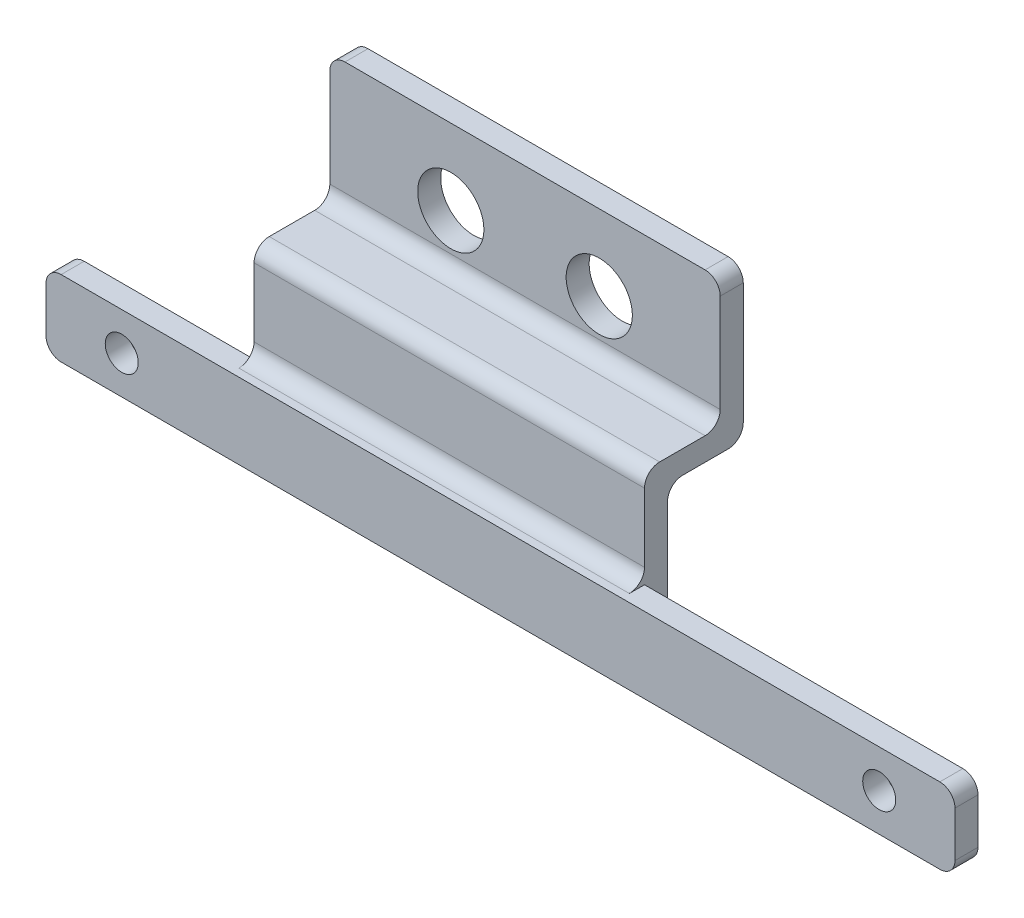
ISO-10303-21;
HEADER;
FILE_DESCRIPTION(('STEP AP214'),'2;1');
FILE_NAME('part.step','',(''),(''),'','','');
FILE_SCHEMA(('AUTOMOTIVE_DESIGN { 1 0 10303 214 1 1 1 1 }'));
ENDSEC;
DATA;
#1=APPLICATION_CONTEXT('core data for automotive mechanical design processes');
#2=APPLICATION_PROTOCOL_DEFINITION('international standard','automotive_design',2000,#1);
#3=PRODUCT_CONTEXT('',#1,'mechanical');
#4=PRODUCT('Part','Part','',(#3));
#5=PRODUCT_RELATED_PRODUCT_CATEGORY('part','',(#4));
#6=PRODUCT_DEFINITION_FORMATION('','',#4);
#7=PRODUCT_DEFINITION_CONTEXT('part definition',#1,'design');
#8=PRODUCT_DEFINITION('design','',#6,#7);
#9=PRODUCT_DEFINITION_SHAPE('','',#8);
#10=(LENGTH_UNIT() NAMED_UNIT(*) SI_UNIT(.MILLI.,.METRE.));
#11=(NAMED_UNIT(*) PLANE_ANGLE_UNIT() SI_UNIT($,.RADIAN.));
#12=(NAMED_UNIT(*) SI_UNIT($,.STERADIAN.) SOLID_ANGLE_UNIT());
#13=UNCERTAINTY_MEASURE_WITH_UNIT(LENGTH_MEASURE(1.E-05),#10,'distance_accuracy_value','');
#14=(GEOMETRIC_REPRESENTATION_CONTEXT(3) GLOBAL_UNCERTAINTY_ASSIGNED_CONTEXT((#13)) GLOBAL_UNIT_ASSIGNED_CONTEXT((#10,
#11,#12)) REPRESENTATION_CONTEXT('',''));
#15=CARTESIAN_POINT('',(0.,0.,0.));
#16=DIRECTION('',(0.,0.,1.));
#17=DIRECTION('',(1.,0.,0.));
#18=AXIS2_PLACEMENT_3D('',#15,#16,#17);
#19=CARTESIAN_POINT('',(0.,0.,6.52));
#20=DIRECTION('',(0.,0.,-1.));
#21=DIRECTION('',(-1.,0.,0.));
#22=AXIS2_PLACEMENT_3D('',#19,#20,#21);
#23=PLANE('',#22);
#24=DIRECTION('',(0.,-1.,0.));
#25=VECTOR('',#24,1.);
#26=CARTESIAN_POINT('',(-12.885,-5.,6.52));
#27=LINE('',#26,#25);
#28=CARTESIAN_POINT('',(-12.885,-4.48,6.52));
#29=VERTEX_POINT('',#28);
#30=CARTESIAN_POINT('',(-12.885,-9.,6.52));
#31=VERTEX_POINT('',#30);
#32=EDGE_CURVE('E229',#29,#31,#27,.T.);
#33=ORIENTED_EDGE('',*,*,#32,.T.);
#34=DIRECTION('',(-1.,0.,0.));
#35=VECTOR('',#34,1.);
#36=CARTESIAN_POINT('',(12.885,-9.,6.52));
#37=LINE('',#36,#35);
#38=CARTESIAN_POINT('',(12.885,-9.,6.52));
#39=VERTEX_POINT('',#38);
#40=EDGE_CURVE('E381',#31,#39,#37,.F.);
#41=ORIENTED_EDGE('',*,*,#40,.T.);
#42=DIRECTION('',(0.,1.,0.));
#43=VECTOR('',#42,1.);
#44=CARTESIAN_POINT('',(12.885,-3.48,6.52));
#45=LINE('',#44,#43);
#46=CARTESIAN_POINT('',(12.885,-4.48,6.52));
#47=VERTEX_POINT('',#46);
#48=EDGE_CURVE('E315',#39,#47,#45,.T.);
#49=ORIENTED_EDGE('',*,*,#48,.T.);
#50=DIRECTION('',(-1.,0.,0.));
#51=VECTOR('',#50,1.);
#52=CARTESIAN_POINT('',(0.,-4.48,6.52));
#53=LINE('',#52,#51);
#54=EDGE_CURVE('E377',#47,#29,#53,.T.);
#55=ORIENTED_EDGE('',*,*,#54,.T.);
#56=EDGE_LOOP('',(#33,#41,#49,#55));
#57=FACE_BOUND('',#56,.T.);
#58=ADVANCED_FACE('F33',(#57),#23,.F.);
#59=CARTESIAN_POINT('',(-12.885,-5.,1.52));
#60=DIRECTION('',(0.,1.,0.));
#61=DIRECTION('',(0.,0.,1.));
#62=AXIS2_PLACEMENT_3D('',#59,#60,#61);
#63=PLANE('',#62);
#64=DIRECTION('',(0.,0.,-1.));
#65=VECTOR('',#64,1.);
#66=CARTESIAN_POINT('',(-12.885,-5.,1.52));
#67=LINE('',#66,#65);
#68=CARTESIAN_POINT('',(-12.885,-5.,4.));
#69=VERTEX_POINT('',#68);
#70=CARTESIAN_POINT('',(-12.885,-5.,1.));
#71=VERTEX_POINT('',#70);
#72=EDGE_CURVE('E262',#69,#71,#67,.T.);
#73=ORIENTED_EDGE('',*,*,#72,.T.);
#74=DIRECTION('',(1.,0.,0.));
#75=VECTOR('',#74,1.);
#76=CARTESIAN_POINT('',(-12.885,-5.,1.));
#77=LINE('',#76,#75);
#78=CARTESIAN_POINT('',(12.885,-5.,1.));
#79=VERTEX_POINT('',#78);
#80=EDGE_CURVE('E451',#71,#79,#77,.T.);
#81=ORIENTED_EDGE('',*,*,#80,.T.);
#82=DIRECTION('',(0.,0.,-1.));
#83=VECTOR('',#82,1.);
#84=CARTESIAN_POINT('',(12.885,-5.,1.52));
#85=LINE('',#84,#83);
#86=CARTESIAN_POINT('',(12.885,-5.,4.));
#87=VERTEX_POINT('',#86);
#88=EDGE_CURVE('E284',#87,#79,#85,.T.);
#89=ORIENTED_EDGE('',*,*,#88,.F.);
#90=DIRECTION('',(1.,0.,0.));
#91=VECTOR('',#90,1.);
#92=CARTESIAN_POINT('',(-12.885,-5.,4.));
#93=LINE('',#92,#91);
#94=EDGE_CURVE('E449',#87,#69,#93,.F.);
#95=ORIENTED_EDGE('',*,*,#94,.T.);
#96=EDGE_LOOP('',(#73,#81,#89,#95));
#97=FACE_BOUND('',#96,.T.);
#98=ADVANCED_FACE('F526',(#97),#63,.F.);
#99=CARTESIAN_POINT('',(0.,0.,1.52));
#100=DIRECTION('',(0.,0.,1.));
#101=DIRECTION('',(1.,0.,0.));
#102=AXIS2_PLACEMENT_3D('',#99,#100,#101);
#103=PLANE('',#102);
#104=DIRECTION('',(0.,-1.,0.));
#105=VECTOR('',#104,1.);
#106=CARTESIAN_POINT('',(-12.885,5.,1.52));
#107=LINE('',#106,#105);
#108=CARTESIAN_POINT('',(-12.885,4.,1.52));
#109=VERTEX_POINT('',#108);
#110=CARTESIAN_POINT('',(-12.885,-2.48,1.52));
#111=VERTEX_POINT('',#110);
#112=EDGE_CURVE('E274',#109,#111,#107,.T.);
#113=ORIENTED_EDGE('',*,*,#112,.T.);
#114=DIRECTION('',(-1.,0.,0.));
#115=VECTOR('',#114,1.);
#116=CARTESIAN_POINT('',(0.,-2.48,1.52));
#117=LINE('',#116,#115);
#118=CARTESIAN_POINT('',(12.885,-2.48,1.52));
#119=VERTEX_POINT('',#118);
#120=EDGE_CURVE('E397',#111,#119,#117,.F.);
#121=ORIENTED_EDGE('',*,*,#120,.T.);
#122=DIRECTION('',(0.,1.,0.));
#123=VECTOR('',#122,1.);
#124=CARTESIAN_POINT('',(12.885,5.,1.52));
#125=LINE('',#124,#123);
#126=CARTESIAN_POINT('',(12.885,4.,1.52));
#127=VERTEX_POINT('',#126);
#128=EDGE_CURVE('E269',#119,#127,#125,.T.);
#129=ORIENTED_EDGE('',*,*,#128,.T.);
#130=CARTESIAN_POINT('',(11.885,4.,1.52));
#131=DIRECTION('',(0.,0.,1.));
#132=DIRECTION('',(1.,0.,0.));
#133=AXIS2_PLACEMENT_3D('',#130,#131,#132);
#134=CIRCLE('',#133,1.);
#135=CARTESIAN_POINT('',(11.885,5.,1.52));
#136=VERTEX_POINT('',#135);
#137=EDGE_CURVE('E393',#127,#136,#134,.T.);
#138=ORIENTED_EDGE('',*,*,#137,.T.);
#139=DIRECTION('',(-1.,0.,0.));
#140=VECTOR('',#139,1.);
#141=CARTESIAN_POINT('',(-12.885,5.,1.52));
#142=LINE('',#141,#140);
#143=CARTESIAN_POINT('',(-11.885,5.,1.52));
#144=VERTEX_POINT('',#143);
#145=EDGE_CURVE('E273',#136,#144,#142,.T.);
#146=ORIENTED_EDGE('',*,*,#145,.T.);
#147=CARTESIAN_POINT('',(-11.885,4.,1.52));
#148=DIRECTION('',(0.,0.,1.));
#149=DIRECTION('',(1.,0.,0.));
#150=AXIS2_PLACEMENT_3D('',#147,#148,#149);
#151=CIRCLE('',#150,1.);
#152=EDGE_CURVE('E395',#144,#109,#151,.T.);
#153=ORIENTED_EDGE('',*,*,#152,.T.);
#154=EDGE_LOOP('',(#113,#121,#129,#138,#146,#153));
#155=FACE_BOUND('',#154,.T.);
#156=CARTESIAN_POINT('',(-4.89999999999999,0.,1.52));
#157=DIRECTION('',(0.,0.,1.));
#158=DIRECTION('',(1.,0.,0.));
#159=AXIS2_PLACEMENT_3D('',#156,#157,#158);
#160=CIRCLE('',#159,2.18499999999998);
#161=CARTESIAN_POINT('',(-2.71500000000001,0.,1.52));
#162=VERTEX_POINT('',#161);
#163=EDGE_CURVE('E289',#162,#162,#160,.T.);
#164=ORIENTED_EDGE('',*,*,#163,.F.);
#165=EDGE_LOOP('',(#164));
#166=FACE_BOUND('',#165,.T.);
#167=CARTESIAN_POINT('',(4.90000000000002,0.,1.52));
#168=DIRECTION('',(0.,0.,1.));
#169=DIRECTION('',(1.,0.,0.));
#170=AXIS2_PLACEMENT_3D('',#167,#168,#169);
#171=CIRCLE('',#170,2.185);
#172=CARTESIAN_POINT('',(7.08500000000001,0.,1.52));
#173=VERTEX_POINT('',#172);
#174=EDGE_CURVE('E329',#173,#173,#171,.T.);
#175=ORIENTED_EDGE('',*,*,#174,.F.);
#176=EDGE_LOOP('',(#175));
#177=FACE_BOUND('',#176,.T.);
#178=ADVANCED_FACE('F420',(#155,#166,#177),#103,.T.);
#179=CARTESIAN_POINT('',(0.,0.,0.));
#180=DIRECTION('',(0.,0.,1.));
#181=DIRECTION('',(1.,0.,0.));
#182=AXIS2_PLACEMENT_3D('',#179,#180,#181);
#183=PLANE('',#182);
#184=DIRECTION('',(0.,1.,0.));
#185=VECTOR('',#184,1.);
#186=CARTESIAN_POINT('',(12.885,5.,0.));
#187=LINE('',#186,#185);
#188=CARTESIAN_POINT('',(12.885,-4.,0.));
#189=VERTEX_POINT('',#188);
#190=CARTESIAN_POINT('',(12.885,4.,0.));
#191=VERTEX_POINT('',#190);
#192=EDGE_CURVE('E288',#189,#191,#187,.T.);
#193=ORIENTED_EDGE('',*,*,#192,.F.);
#194=DIRECTION('',(1.,0.,0.));
#195=VECTOR('',#194,1.);
#196=CARTESIAN_POINT('',(0.,-4.,0.));
#197=LINE('',#196,#195);
#198=CARTESIAN_POINT('',(-12.885,-4.,0.));
#199=VERTEX_POINT('',#198);
#200=EDGE_CURVE('E458',#189,#199,#197,.F.);
#201=ORIENTED_EDGE('',*,*,#200,.T.);
#202=DIRECTION('',(0.,-1.,0.));
#203=VECTOR('',#202,1.);
#204=CARTESIAN_POINT('',(-12.885,5.,0.));
#205=LINE('',#204,#203);
#206=CARTESIAN_POINT('',(-12.885,4.,0.));
#207=VERTEX_POINT('',#206);
#208=EDGE_CURVE('E285',#207,#199,#205,.T.);
#209=ORIENTED_EDGE('',*,*,#208,.F.);
#210=CARTESIAN_POINT('',(-11.885,4.,0.));
#211=DIRECTION('',(0.,0.,1.));
#212=DIRECTION('',(1.,0.,0.));
#213=AXIS2_PLACEMENT_3D('',#210,#211,#212);
#214=CIRCLE('',#213,1.);
#215=CARTESIAN_POINT('',(-11.885,5.,0.));
#216=VERTEX_POINT('',#215);
#217=EDGE_CURVE('E456',#207,#216,#214,.F.);
#218=ORIENTED_EDGE('',*,*,#217,.T.);
#219=DIRECTION('',(-1.,0.,0.));
#220=VECTOR('',#219,1.);
#221=CARTESIAN_POINT('',(-12.885,5.,0.));
#222=LINE('',#221,#220);
#223=CARTESIAN_POINT('',(11.885,5.,0.));
#224=VERTEX_POINT('',#223);
#225=EDGE_CURVE('E292',#224,#216,#222,.T.);
#226=ORIENTED_EDGE('',*,*,#225,.F.);
#227=CARTESIAN_POINT('',(11.885,4.,0.));
#228=DIRECTION('',(0.,0.,1.));
#229=DIRECTION('',(1.,0.,0.));
#230=AXIS2_PLACEMENT_3D('',#227,#228,#229);
#231=CIRCLE('',#230,1.);
#232=EDGE_CURVE('E454',#224,#191,#231,.F.);
#233=ORIENTED_EDGE('',*,*,#232,.T.);
#234=EDGE_LOOP('',(#193,#201,#209,#218,#226,#233));
#235=FACE_BOUND('',#234,.T.);
#236=CARTESIAN_POINT('',(-4.89999999999999,0.,0.));
#237=DIRECTION('',(0.,0.,1.));
#238=DIRECTION('',(1.,0.,0.));
#239=AXIS2_PLACEMENT_3D('',#236,#237,#238);
#240=CIRCLE('',#239,2.18499999999998);
#241=CARTESIAN_POINT('',(-2.71500000000001,0.,0.));
#242=VERTEX_POINT('',#241);
#243=EDGE_CURVE('E847',#242,#242,#240,.T.);
#244=ORIENTED_EDGE('',*,*,#243,.T.);
#245=EDGE_LOOP('',(#244));
#246=FACE_BOUND('',#245,.T.);
#247=CARTESIAN_POINT('',(4.90000000000002,0.,0.));
#248=DIRECTION('',(0.,0.,1.));
#249=DIRECTION('',(1.,0.,0.));
#250=AXIS2_PLACEMENT_3D('',#247,#248,#249);
#251=CIRCLE('',#250,2.185);
#252=CARTESIAN_POINT('',(7.08500000000001,0.,0.));
#253=VERTEX_POINT('',#252);
#254=EDGE_CURVE('E433',#253,#253,#251,.T.);
#255=ORIENTED_EDGE('',*,*,#254,.T.);
#256=EDGE_LOOP('',(#255));
#257=FACE_BOUND('',#256,.T.);
#258=ADVANCED_FACE('F551',(#235,#246,#257),#183,.F.);
#259=CARTESIAN_POINT('',(-12.885,5.,1.52));
#260=DIRECTION('',(1.,0.,0.));
#261=DIRECTION('',(0.,0.,-1.));
#262=AXIS2_PLACEMENT_3D('',#259,#260,#261);
#263=PLANE('',#262);
#264=DIRECTION('',(0.,1.,0.));
#265=VECTOR('',#264,1.);
#266=CARTESIAN_POINT('',(-12.885,-15.,5.));
#267=LINE('',#266,#265);
#268=CARTESIAN_POINT('',(-12.885,-14.,5.));
#269=VERTEX_POINT('',#268);
#270=CARTESIAN_POINT('',(-12.885,-6.,5.));
#271=VERTEX_POINT('',#270);
#272=EDGE_CURVE('E311',#269,#271,#267,.T.);
#273=ORIENTED_EDGE('',*,*,#272,.F.);
#274=CARTESIAN_POINT('',(-12.885,-14.,6.));
#275=DIRECTION('',(1.,0.,0.));
#276=DIRECTION('',(0.,0.,-1.));
#277=AXIS2_PLACEMENT_3D('',#274,#275,#276);
#278=CIRCLE('',#277,1.);
#279=CARTESIAN_POINT('',(-12.885,-15.,6.));
#280=VERTEX_POINT('',#279);
#281=EDGE_CURVE('E447',#269,#280,#278,.F.);
#282=ORIENTED_EDGE('',*,*,#281,.T.);
#283=DIRECTION('',(0.,0.,-1.));
#284=VECTOR('',#283,1.);
#285=CARTESIAN_POINT('',(-12.885,-15.,6.52));
#286=LINE('',#285,#284);
#287=CARTESIAN_POINT('',(-12.885,-15.,6.52));
#288=VERTEX_POINT('',#287);
#289=EDGE_CURVE('E226',#288,#280,#286,.T.);
#290=ORIENTED_EDGE('',*,*,#289,.F.);
#291=CARTESIAN_POINT('',(-12.885,-10.,6.52));
#292=VERTEX_POINT('',#291);
#293=EDGE_CURVE('E222',#292,#288,#27,.T.);
#294=ORIENTED_EDGE('',*,*,#293,.F.);
#295=DIRECTION('',(0.,0.,-1.));
#296=VECTOR('',#295,1.);
#297=CARTESIAN_POINT('',(-12.885,-10.,1.52));
#298=LINE('',#297,#296);
#299=CARTESIAN_POINT('',(-12.885,-10.,7.52));
#300=VERTEX_POINT('',#299);
#301=EDGE_CURVE('E209',#300,#292,#298,.T.);
#302=ORIENTED_EDGE('',*,*,#301,.F.);
#303=CARTESIAN_POINT('',(-12.885,-9.,7.52));
#304=DIRECTION('',(1.,0.,0.));
#305=DIRECTION('',(0.,0.,-1.));
#306=AXIS2_PLACEMENT_3D('',#303,#304,#305);
#307=CIRCLE('',#306,1.);
#308=EDGE_CURVE('E407',#300,#31,#307,.T.);
#309=ORIENTED_EDGE('',*,*,#308,.T.);
#310=ORIENTED_EDGE('',*,*,#32,.F.);
#311=CARTESIAN_POINT('',(-12.885,-4.48,5.52));
#312=DIRECTION('',(1.,0.,0.));
#313=DIRECTION('',(0.,0.,-1.));
#314=AXIS2_PLACEMENT_3D('',#311,#312,#313);
#315=CIRCLE('',#314,1.);
#316=CARTESIAN_POINT('',(-12.885,-3.48,5.52));
#317=VERTEX_POINT('',#316);
#318=EDGE_CURVE('E442',#29,#317,#315,.F.);
#319=ORIENTED_EDGE('',*,*,#318,.T.);
#320=DIRECTION('',(0.,0.,-1.));
#321=VECTOR('',#320,1.);
#322=CARTESIAN_POINT('',(-12.885,-3.48,6.52));
#323=LINE('',#322,#321);
#324=CARTESIAN_POINT('',(-12.885,-3.48,2.52));
#325=VERTEX_POINT('',#324);
#326=EDGE_CURVE('E328',#317,#325,#323,.T.);
#327=ORIENTED_EDGE('',*,*,#326,.T.);
#328=CARTESIAN_POINT('',(-12.885,-2.48,2.52));
#329=DIRECTION('',(1.,0.,0.));
#330=DIRECTION('',(0.,0.,-1.));
#331=AXIS2_PLACEMENT_3D('',#328,#329,#330);
#332=CIRCLE('',#331,1.);
#333=EDGE_CURVE('E41',#325,#111,#332,.T.);
#334=ORIENTED_EDGE('',*,*,#333,.T.);
#335=ORIENTED_EDGE('',*,*,#112,.F.);
#336=DIRECTION('',(0.,0.,-1.));
#337=VECTOR('',#336,1.);
#338=CARTESIAN_POINT('',(-12.885,4.,1.52));
#339=LINE('',#338,#337);
#340=EDGE_CURVE('E440',#109,#207,#339,.T.);
#341=ORIENTED_EDGE('',*,*,#340,.T.);
#342=ORIENTED_EDGE('',*,*,#208,.T.);
#343=CARTESIAN_POINT('',(-12.885,-4.,1.));
#344=DIRECTION('',(1.,0.,0.));
#345=DIRECTION('',(0.,0.,-1.));
#346=AXIS2_PLACEMENT_3D('',#343,#344,#345);
#347=CIRCLE('',#346,1.);
#348=EDGE_CURVE('E445',#199,#71,#347,.F.);
#349=ORIENTED_EDGE('',*,*,#348,.T.);
#350=ORIENTED_EDGE('',*,*,#72,.F.);
#351=CARTESIAN_POINT('',(-12.885,-6.,4.));
#352=DIRECTION('',(1.,0.,0.));
#353=DIRECTION('',(0.,0.,-1.));
#354=AXIS2_PLACEMENT_3D('',#351,#352,#353);
#355=CIRCLE('',#354,1.);
#356=EDGE_CURVE('E405',#69,#271,#355,.T.);
#357=ORIENTED_EDGE('',*,*,#356,.T.);
#358=EDGE_LOOP('',(#273,#282,#290,#294,#302,#309,#310,#319,#327,#334,#335,#341,#342,#349,#350,#357));
#359=FACE_BOUND('',#358,.T.);
#360=ADVANCED_FACE('F224',(#359),#263,.F.);
#361=CARTESIAN_POINT('',(12.885,5.,1.52));
#362=DIRECTION('',(-1.,0.,0.));
#363=DIRECTION('',(0.,0.,1.));
#364=AXIS2_PLACEMENT_3D('',#361,#362,#363);
#365=PLANE('',#364);
#366=DIRECTION('',(0.,0.,1.));
#367=VECTOR('',#366,1.);
#368=CARTESIAN_POINT('',(12.885,-15.,5.));
#369=LINE('',#368,#367);
#370=CARTESIAN_POINT('',(12.885,-15.,6.));
#371=VERTEX_POINT('',#370);
#372=CARTESIAN_POINT('',(12.885,-15.,6.52));
#373=VERTEX_POINT('',#372);
#374=EDGE_CURVE('E256',#371,#373,#369,.T.);
#375=ORIENTED_EDGE('',*,*,#374,.F.);
#376=CARTESIAN_POINT('',(12.885,-14.,6.));
#377=DIRECTION('',(-1.,0.,0.));
#378=DIRECTION('',(0.,0.,1.));
#379=AXIS2_PLACEMENT_3D('',#376,#377,#378);
#380=CIRCLE('',#379,1.);
#381=CARTESIAN_POINT('',(12.885,-14.,5.));
#382=VERTEX_POINT('',#381);
#383=EDGE_CURVE('E308',#371,#382,#380,.F.);
#384=ORIENTED_EDGE('',*,*,#383,.T.);
#385=DIRECTION('',(0.,1.,0.));
#386=VECTOR('',#385,1.);
#387=CARTESIAN_POINT('',(12.885,-15.,5.));
#388=LINE('',#387,#386);
#389=CARTESIAN_POINT('',(12.885,-6.,5.));
#390=VERTEX_POINT('',#389);
#391=EDGE_CURVE('E301',#382,#390,#388,.T.);
#392=ORIENTED_EDGE('',*,*,#391,.T.);
#393=CARTESIAN_POINT('',(12.885,-6.,4.));
#394=DIRECTION('',(-1.,0.,0.));
#395=DIRECTION('',(0.,0.,1.));
#396=AXIS2_PLACEMENT_3D('',#393,#394,#395);
#397=CIRCLE('',#396,1.);
#398=EDGE_CURVE('E403',#390,#87,#397,.T.);
#399=ORIENTED_EDGE('',*,*,#398,.T.);
#400=ORIENTED_EDGE('',*,*,#88,.T.);
#401=CARTESIAN_POINT('',(12.885,-4.,1.));
#402=DIRECTION('',(-1.,0.,0.));
#403=DIRECTION('',(0.,0.,1.));
#404=AXIS2_PLACEMENT_3D('',#401,#402,#403);
#405=CIRCLE('',#404,1.);
#406=EDGE_CURVE('E306',#79,#189,#405,.F.);
#407=ORIENTED_EDGE('',*,*,#406,.T.);
#408=ORIENTED_EDGE('',*,*,#192,.T.);
#409=DIRECTION('',(0.,0.,-1.));
#410=VECTOR('',#409,1.);
#411=CARTESIAN_POINT('',(12.885,4.,1.52));
#412=LINE('',#411,#410);
#413=EDGE_CURVE('E268',#191,#127,#412,.F.);
#414=ORIENTED_EDGE('',*,*,#413,.T.);
#415=ORIENTED_EDGE('',*,*,#128,.F.);
#416=CARTESIAN_POINT('',(12.885,-2.48,2.52));
#417=DIRECTION('',(-1.,0.,0.));
#418=DIRECTION('',(0.,0.,1.));
#419=AXIS2_PLACEMENT_3D('',#416,#417,#418);
#420=CIRCLE('',#419,1.);
#421=CARTESIAN_POINT('',(12.885,-3.48,2.52));
#422=VERTEX_POINT('',#421);
#423=EDGE_CURVE('E11',#119,#422,#420,.T.);
#424=ORIENTED_EDGE('',*,*,#423,.T.);
#425=DIRECTION('',(0.,0.,-1.));
#426=VECTOR('',#425,1.);
#427=CARTESIAN_POINT('',(12.885,-3.48,6.52));
#428=LINE('',#427,#426);
#429=CARTESIAN_POINT('',(12.885,-3.48,5.52));
#430=VERTEX_POINT('',#429);
#431=EDGE_CURVE('E275',#430,#422,#428,.T.);
#432=ORIENTED_EDGE('',*,*,#431,.F.);
#433=CARTESIAN_POINT('',(12.885,-4.48,5.52));
#434=DIRECTION('',(-1.,0.,0.));
#435=DIRECTION('',(0.,0.,1.));
#436=AXIS2_PLACEMENT_3D('',#433,#434,#435);
#437=CIRCLE('',#436,1.);
#438=EDGE_CURVE('E304',#430,#47,#437,.F.);
#439=ORIENTED_EDGE('',*,*,#438,.T.);
#440=ORIENTED_EDGE('',*,*,#48,.F.);
#441=CARTESIAN_POINT('',(12.885,-9.,7.52));
#442=DIRECTION('',(-1.,0.,0.));
#443=DIRECTION('',(0.,0.,1.));
#444=AXIS2_PLACEMENT_3D('',#441,#442,#443);
#445=CIRCLE('',#444,1.);
#446=CARTESIAN_POINT('',(12.885,-10.,7.52));
#447=VERTEX_POINT('',#446);
#448=EDGE_CURVE('E409',#39,#447,#445,.T.);
#449=ORIENTED_EDGE('',*,*,#448,.T.);
#450=DIRECTION('',(0.,0.,1.));
#451=VECTOR('',#450,1.);
#452=CARTESIAN_POINT('',(12.885,-10.,1.52));
#453=LINE('',#452,#451);
#454=CARTESIAN_POINT('',(12.885,-10.,6.52));
#455=VERTEX_POINT('',#454);
#456=EDGE_CURVE('E48',#455,#447,#453,.T.);
#457=ORIENTED_EDGE('',*,*,#456,.F.);
#458=EDGE_CURVE('E230',#373,#455,#45,.T.);
#459=ORIENTED_EDGE('',*,*,#458,.F.);
#460=EDGE_LOOP('',(#375,#384,#392,#399,#400,#407,#408,#414,#415,#424,#432,#439,#440,#449,#457,#459));
#461=FACE_BOUND('',#460,.T.);
#462=ADVANCED_FACE('F368',(#461),#365,.F.);
#463=CARTESIAN_POINT('',(-12.885,5.,1.52));
#464=DIRECTION('',(0.,-1.,0.));
#465=DIRECTION('',(1.,0.,0.));
#466=AXIS2_PLACEMENT_3D('',#463,#464,#465);
#467=PLANE('',#466);
#468=ORIENTED_EDGE('',*,*,#225,.T.);
#469=DIRECTION('',(0.,0.,-1.));
#470=VECTOR('',#469,1.);
#471=CARTESIAN_POINT('',(-11.885,5.,1.52));
#472=LINE('',#471,#470);
#473=EDGE_CURVE('E56',#216,#144,#472,.F.);
#474=ORIENTED_EDGE('',*,*,#473,.T.);
#475=ORIENTED_EDGE('',*,*,#145,.F.);
#476=DIRECTION('',(0.,0.,-1.));
#477=VECTOR('',#476,1.);
#478=CARTESIAN_POINT('',(11.885,5.,1.52));
#479=LINE('',#478,#477);
#480=EDGE_CURVE('E399',#136,#224,#479,.T.);
#481=ORIENTED_EDGE('',*,*,#480,.T.);
#482=EDGE_LOOP('',(#468,#474,#475,#481));
#483=FACE_BOUND('',#482,.T.);
#484=ADVANCED_FACE('F547',(#483),#467,.F.);
#485=CARTESIAN_POINT('',(-4.89999999999999,0.,1.52));
#486=DIRECTION('',(0.,0.,-1.));
#487=DIRECTION('',(-1.,0.,0.));
#488=AXIS2_PLACEMENT_3D('',#485,#486,#487);
#489=CYLINDRICAL_SURFACE('',#488,2.18499999999998);
#490=ORIENTED_EDGE('',*,*,#163,.T.);
#491=EDGE_LOOP('',(#490));
#492=FACE_BOUND('',#491,.T.);
#493=ORIENTED_EDGE('',*,*,#243,.F.);
#494=EDGE_LOOP('',(#493));
#495=FACE_BOUND('',#494,.T.);
#496=ADVANCED_FACE('F543',(#492,#495),#489,.F.);
#497=CARTESIAN_POINT('',(4.90000000000002,0.,1.52));
#498=DIRECTION('',(0.,0.,-1.));
#499=DIRECTION('',(-1.,0.,0.));
#500=AXIS2_PLACEMENT_3D('',#497,#498,#499);
#501=CYLINDRICAL_SURFACE('',#500,2.185);
#502=ORIENTED_EDGE('',*,*,#174,.T.);
#503=EDGE_LOOP('',(#502));
#504=FACE_BOUND('',#503,.T.);
#505=ORIENTED_EDGE('',*,*,#254,.F.);
#506=EDGE_LOOP('',(#505));
#507=FACE_BOUND('',#506,.T.);
#508=ADVANCED_FACE('F540',(#504,#507),#501,.F.);
#509=CARTESIAN_POINT('',(-12.885,-3.48,6.52));
#510=DIRECTION('',(0.,-1.,0.));
#511=DIRECTION('',(0.,0.,-1.));
#512=AXIS2_PLACEMENT_3D('',#509,#510,#511);
#513=PLANE('',#512);
#514=ORIENTED_EDGE('',*,*,#326,.F.);
#515=DIRECTION('',(-1.,0.,0.));
#516=VECTOR('',#515,1.);
#517=CARTESIAN_POINT('',(-12.885,-3.48,5.52));
#518=LINE('',#517,#516);
#519=EDGE_CURVE('E391',#317,#430,#518,.F.);
#520=ORIENTED_EDGE('',*,*,#519,.T.);
#521=ORIENTED_EDGE('',*,*,#431,.T.);
#522=DIRECTION('',(-1.,0.,0.));
#523=VECTOR('',#522,1.);
#524=CARTESIAN_POINT('',(-12.885,-3.48,2.52));
#525=LINE('',#524,#523);
#526=EDGE_CURVE('E388',#422,#325,#525,.T.);
#527=ORIENTED_EDGE('',*,*,#526,.T.);
#528=EDGE_LOOP('',(#514,#520,#521,#527));
#529=FACE_BOUND('',#528,.T.);
#530=ADVANCED_FACE('F431',(#529),#513,.F.);
#531=CARTESIAN_POINT('',(-12.885,-15.,5.));
#532=DIRECTION('',(0.,0.,1.));
#533=DIRECTION('',(1.,0.,0.));
#534=AXIS2_PLACEMENT_3D('',#531,#532,#533);
#535=PLANE('',#534);
#536=ORIENTED_EDGE('',*,*,#391,.F.);
#537=DIRECTION('',(1.,0.,0.));
#538=VECTOR('',#537,1.);
#539=CARTESIAN_POINT('',(-12.885,-14.,5.));
#540=LINE('',#539,#538);
#541=EDGE_CURVE('E443',#382,#269,#540,.F.);
#542=ORIENTED_EDGE('',*,*,#541,.T.);
#543=ORIENTED_EDGE('',*,*,#272,.T.);
#544=DIRECTION('',(1.,0.,0.));
#545=VECTOR('',#544,1.);
#546=CARTESIAN_POINT('',(12.885,-6.,5.));
#547=LINE('',#546,#545);
#548=EDGE_CURVE('E310',#271,#390,#547,.T.);
#549=ORIENTED_EDGE('',*,*,#548,.T.);
#550=EDGE_LOOP('',(#536,#542,#543,#549));
#551=FACE_BOUND('',#550,.T.);
#552=ADVANCED_FACE('F536',(#551),#535,.F.);
#553=CARTESIAN_POINT('',(0.,-15.,0.));
#554=DIRECTION('',(0.,-1.,0.));
#555=DIRECTION('',(0.,0.,-1.));
#556=AXIS2_PLACEMENT_3D('',#553,#554,#555);
#557=PLANE('',#556);
#558=ORIENTED_EDGE('',*,*,#289,.T.);
#559=DIRECTION('',(1.,0.,0.));
#560=VECTOR('',#559,1.);
#561=CARTESIAN_POINT('',(12.885,-15.,6.));
#562=LINE('',#561,#560);
#563=EDGE_CURVE('E265',#280,#371,#562,.T.);
#564=ORIENTED_EDGE('',*,*,#563,.T.);
#565=ORIENTED_EDGE('',*,*,#374,.T.);
#566=DIRECTION('',(1.,0.,0.));
#567=VECTOR('',#566,1.);
#568=CARTESIAN_POINT('',(-12.885,-15.,6.52));
#569=LINE('',#568,#567);
#570=CARTESIAN_POINT('',(33.9,-15.,6.52));
#571=VERTEX_POINT('',#570);
#572=EDGE_CURVE('E246',#373,#571,#569,.T.);
#573=ORIENTED_EDGE('',*,*,#572,.T.);
#574=DIRECTION('',(0.,0.,-1.));
#575=VECTOR('',#574,1.);
#576=CARTESIAN_POINT('',(33.9,-15.,8.04));
#577=LINE('',#576,#575);
#578=CARTESIAN_POINT('',(33.9,-15.,8.04));
#579=VERTEX_POINT('',#578);
#580=EDGE_CURVE('E259',#571,#579,#577,.F.);
#581=ORIENTED_EDGE('',*,*,#580,.T.);
#582=DIRECTION('',(1.,0.,0.));
#583=VECTOR('',#582,1.);
#584=CARTESIAN_POINT('',(34.9,-15.,8.04));
#585=LINE('',#584,#583);
#586=CARTESIAN_POINT('',(-24.1,-15.,8.04));
#587=VERTEX_POINT('',#586);
#588=EDGE_CURVE('E255',#587,#579,#585,.T.);
#589=ORIENTED_EDGE('',*,*,#588,.F.);
#590=DIRECTION('',(0.,0.,-1.));
#591=VECTOR('',#590,1.);
#592=CARTESIAN_POINT('',(-24.1,-15.,6.52));
#593=LINE('',#592,#591);
#594=CARTESIAN_POINT('',(-24.1,-15.,6.52));
#595=VERTEX_POINT('',#594);
#596=EDGE_CURVE('E261',#587,#595,#593,.T.);
#597=ORIENTED_EDGE('',*,*,#596,.T.);
#598=EDGE_CURVE('E252',#595,#288,#569,.T.);
#599=ORIENTED_EDGE('',*,*,#598,.T.);
#600=EDGE_LOOP('',(#558,#564,#565,#573,#581,#589,#597,#599));
#601=FACE_BOUND('',#600,.T.);
#602=ADVANCED_FACE('F364',(#601),#557,.T.);
#603=CARTESIAN_POINT('',(0.,0.,6.52));
#604=DIRECTION('',(0.,0.,-1.));
#605=DIRECTION('',(-1.,0.,0.));
#606=AXIS2_PLACEMENT_3D('',#603,#604,#605);
#607=PLANE('',#606);
#608=CARTESIAN_POINT('',(-20.1,-12.5,6.52));
#609=DIRECTION('',(0.,0.,-1.));
#610=DIRECTION('',(-1.,0.,0.));
#611=AXIS2_PLACEMENT_3D('',#608,#609,#610);
#612=CIRCLE('',#611,1.09);
#613=CARTESIAN_POINT('',(-21.19,-12.5,6.52));
#614=VERTEX_POINT('',#613);
#615=EDGE_CURVE('E240',#614,#614,#612,.T.);
#616=ORIENTED_EDGE('',*,*,#615,.F.);
#617=EDGE_LOOP('',(#616));
#618=FACE_BOUND('',#617,.T.);
#619=ORIENTED_EDGE('',*,*,#598,.F.);
#620=CARTESIAN_POINT('',(-24.1,-14.,6.52));
#621=DIRECTION('',(0.,0.,-1.));
#622=DIRECTION('',(-1.,0.,0.));
#623=AXIS2_PLACEMENT_3D('',#620,#621,#622);
#624=CIRCLE('',#623,1.);
#625=CARTESIAN_POINT('',(-25.1,-14.,6.52));
#626=VERTEX_POINT('',#625);
#627=EDGE_CURVE('E461',#595,#626,#624,.T.);
#628=ORIENTED_EDGE('',*,*,#627,.T.);
#629=DIRECTION('',(0.,-1.,0.));
#630=VECTOR('',#629,1.);
#631=CARTESIAN_POINT('',(-25.1,-15.,6.52));
#632=LINE('',#631,#630);
#633=CARTESIAN_POINT('',(-25.1,-11.,6.52));
#634=VERTEX_POINT('',#633);
#635=EDGE_CURVE('E238',#634,#626,#632,.T.);
#636=ORIENTED_EDGE('',*,*,#635,.F.);
#637=CARTESIAN_POINT('',(-24.1,-11.,6.52));
#638=DIRECTION('',(0.,0.,-1.));
#639=DIRECTION('',(-1.,0.,0.));
#640=AXIS2_PLACEMENT_3D('',#637,#638,#639);
#641=CIRCLE('',#640,1.);
#642=CARTESIAN_POINT('',(-24.1,-10.,6.52));
#643=VERTEX_POINT('',#642);
#644=EDGE_CURVE('E234',#634,#643,#641,.T.);
#645=ORIENTED_EDGE('',*,*,#644,.T.);
#646=DIRECTION('',(-1.,0.,0.));
#647=VECTOR('',#646,1.);
#648=CARTESIAN_POINT('',(-25.1,-10.,6.52));
#649=LINE('',#648,#647);
#650=EDGE_CURVE('E213',#292,#643,#649,.T.);
#651=ORIENTED_EDGE('',*,*,#650,.F.);
#652=ORIENTED_EDGE('',*,*,#293,.T.);
#653=EDGE_LOOP('',(#619,#628,#636,#645,#651,#652));
#654=FACE_BOUND('',#653,.T.);
#655=ADVANCED_FACE('F232',(#618,#654),#607,.T.);
#656=CARTESIAN_POINT('',(34.9,-10.,8.04));
#657=DIRECTION('',(-1.,0.,0.));
#658=DIRECTION('',(0.,0.,1.));
#659=AXIS2_PLACEMENT_3D('',#656,#657,#658);
#660=PLANE('',#659);
#661=DIRECTION('',(0.,1.,0.));
#662=VECTOR('',#661,1.);
#663=CARTESIAN_POINT('',(34.9,-10.,8.04));
#664=LINE('',#663,#662);
#665=CARTESIAN_POINT('',(34.9,-14.,8.04));
#666=VERTEX_POINT('',#665);
#667=CARTESIAN_POINT('',(34.9,-11.,8.04));
#668=VERTEX_POINT('',#667);
#669=EDGE_CURVE('E351',#666,#668,#664,.T.);
#670=ORIENTED_EDGE('',*,*,#669,.F.);
#671=DIRECTION('',(0.,0.,-1.));
#672=VECTOR('',#671,1.);
#673=CARTESIAN_POINT('',(34.9,-14.,6.52));
#674=LINE('',#673,#672);
#675=CARTESIAN_POINT('',(34.9,-14.,6.52));
#676=VERTEX_POINT('',#675);
#677=EDGE_CURVE('E383',#666,#676,#674,.T.);
#678=ORIENTED_EDGE('',*,*,#677,.T.);
#679=DIRECTION('',(0.,1.,0.));
#680=VECTOR('',#679,1.);
#681=CARTESIAN_POINT('',(34.9,-10.,6.52));
#682=LINE('',#681,#680);
#683=CARTESIAN_POINT('',(34.9,-11.,6.52));
#684=VERTEX_POINT('',#683);
#685=EDGE_CURVE('E236',#676,#684,#682,.T.);
#686=ORIENTED_EDGE('',*,*,#685,.T.);
#687=DIRECTION('',(0.,0.,-1.));
#688=VECTOR('',#687,1.);
#689=CARTESIAN_POINT('',(34.9,-11.,8.04));
#690=LINE('',#689,#688);
#691=EDGE_CURVE('E482',#684,#668,#690,.F.);
#692=ORIENTED_EDGE('',*,*,#691,.T.);
#693=EDGE_LOOP('',(#670,#678,#686,#692));
#694=FACE_BOUND('',#693,.T.);
#695=ADVANCED_FACE('F485',(#694),#660,.F.);
#696=CARTESIAN_POINT('',(-25.1,-10.,8.04));
#697=DIRECTION('',(0.,-1.,0.));
#698=DIRECTION('',(0.,0.,-1.));
#699=AXIS2_PLACEMENT_3D('',#696,#697,#698);
#700=PLANE('',#699);
#701=ORIENTED_EDGE('',*,*,#650,.T.);
#702=DIRECTION('',(0.,0.,-1.));
#703=VECTOR('',#702,1.);
#704=CARTESIAN_POINT('',(-24.1,-10.,8.04));
#705=LINE('',#704,#703);
#706=CARTESIAN_POINT('',(-24.1,-10.,8.04));
#707=VERTEX_POINT('',#706);
#708=EDGE_CURVE('E480',#643,#707,#705,.F.);
#709=ORIENTED_EDGE('',*,*,#708,.T.);
#710=DIRECTION('',(-1.,0.,0.));
#711=VECTOR('',#710,1.);
#712=CARTESIAN_POINT('',(-25.1,-10.,8.04));
#713=LINE('',#712,#711);
#714=CARTESIAN_POINT('',(33.9,-10.,8.04));
#715=VERTEX_POINT('',#714);
#716=EDGE_CURVE('E354',#715,#707,#713,.T.);
#717=ORIENTED_EDGE('',*,*,#716,.F.);
#718=DIRECTION('',(0.,0.,-1.));
#719=VECTOR('',#718,1.);
#720=CARTESIAN_POINT('',(33.9,-10.,8.04));
#721=LINE('',#720,#719);
#722=CARTESIAN_POINT('',(33.9,-10.,6.52));
#723=VERTEX_POINT('',#722);
#724=EDGE_CURVE('E218',#715,#723,#721,.T.);
#725=ORIENTED_EDGE('',*,*,#724,.T.);
#726=EDGE_CURVE('E235',#723,#455,#649,.T.);
#727=ORIENTED_EDGE('',*,*,#726,.T.);
#728=ORIENTED_EDGE('',*,*,#456,.T.);
#729=DIRECTION('',(-1.,0.,0.));
#730=VECTOR('',#729,1.);
#731=CARTESIAN_POINT('',(-12.885,-10.,7.52));
#732=LINE('',#731,#730);
#733=EDGE_CURVE('E216',#447,#300,#732,.T.);
#734=ORIENTED_EDGE('',*,*,#733,.T.);
#735=ORIENTED_EDGE('',*,*,#301,.T.);
#736=EDGE_LOOP('',(#701,#709,#717,#725,#727,#728,#734,#735));
#737=FACE_BOUND('',#736,.T.);
#738=ADVANCED_FACE('F211',(#737),#700,.F.);
#739=CARTESIAN_POINT('',(-25.1,-15.,8.04));
#740=DIRECTION('',(1.,0.,0.));
#741=DIRECTION('',(0.,0.,-1.));
#742=AXIS2_PLACEMENT_3D('',#739,#740,#741);
#743=PLANE('',#742);
#744=ORIENTED_EDGE('',*,*,#635,.T.);
#745=DIRECTION('',(0.,0.,-1.));
#746=VECTOR('',#745,1.);
#747=CARTESIAN_POINT('',(-25.1,-14.,8.04));
#748=LINE('',#747,#746);
#749=CARTESIAN_POINT('',(-25.1,-14.,8.04));
#750=VERTEX_POINT('',#749);
#751=EDGE_CURVE('E466',#626,#750,#748,.F.);
#752=ORIENTED_EDGE('',*,*,#751,.T.);
#753=DIRECTION('',(0.,-1.,0.));
#754=VECTOR('',#753,1.);
#755=CARTESIAN_POINT('',(-25.1,-15.,8.04));
#756=LINE('',#755,#754);
#757=CARTESIAN_POINT('',(-25.1,-11.,8.04));
#758=VERTEX_POINT('',#757);
#759=EDGE_CURVE('E356',#758,#750,#756,.T.);
#760=ORIENTED_EDGE('',*,*,#759,.F.);
#761=DIRECTION('',(0.,0.,-1.));
#762=VECTOR('',#761,1.);
#763=CARTESIAN_POINT('',(-25.1,-11.,8.04));
#764=LINE('',#763,#762);
#765=EDGE_CURVE('E463',#758,#634,#764,.T.);
#766=ORIENTED_EDGE('',*,*,#765,.T.);
#767=EDGE_LOOP('',(#744,#752,#760,#766));
#768=FACE_BOUND('',#767,.T.);
#769=ADVANCED_FACE('F497',(#768),#743,.F.);
#770=CARTESIAN_POINT('',(0.,0.,8.04));
#771=DIRECTION('',(0.,0.,-1.));
#772=DIRECTION('',(-1.,0.,0.));
#773=AXIS2_PLACEMENT_3D('',#770,#771,#772);
#774=PLANE('',#773);
#775=CARTESIAN_POINT('',(29.9,-12.5,8.04));
#776=DIRECTION('',(0.,0.,-1.));
#777=DIRECTION('',(-1.,0.,0.));
#778=AXIS2_PLACEMENT_3D('',#775,#776,#777);
#779=CIRCLE('',#778,1.09);
#780=CARTESIAN_POINT('',(28.81,-12.5,8.04));
#781=VERTEX_POINT('',#780);
#782=EDGE_CURVE('E337',#781,#781,#779,.T.);
#783=ORIENTED_EDGE('',*,*,#782,.T.);
#784=EDGE_LOOP('',(#783));
#785=FACE_BOUND('',#784,.T.);
#786=CARTESIAN_POINT('',(-20.1,-12.5,8.04));
#787=DIRECTION('',(0.,0.,-1.));
#788=DIRECTION('',(-1.,0.,0.));
#789=AXIS2_PLACEMENT_3D('',#786,#787,#788);
#790=CIRCLE('',#789,1.09);
#791=CARTESIAN_POINT('',(-21.19,-12.5,8.04));
#792=VERTEX_POINT('',#791);
#793=EDGE_CURVE('E335',#792,#792,#790,.T.);
#794=ORIENTED_EDGE('',*,*,#793,.T.);
#795=EDGE_LOOP('',(#794));
#796=FACE_BOUND('',#795,.T.);
#797=ORIENTED_EDGE('',*,*,#759,.T.);
#798=CARTESIAN_POINT('',(-24.1,-14.,8.04));
#799=DIRECTION('',(0.,0.,-1.));
#800=DIRECTION('',(-1.,0.,0.));
#801=AXIS2_PLACEMENT_3D('',#798,#799,#800);
#802=CIRCLE('',#801,1.);
#803=EDGE_CURVE('E474',#750,#587,#802,.F.);
#804=ORIENTED_EDGE('',*,*,#803,.T.);
#805=ORIENTED_EDGE('',*,*,#588,.T.);
#806=CARTESIAN_POINT('',(33.9,-14.,8.04));
#807=DIRECTION('',(0.,0.,-1.));
#808=DIRECTION('',(-1.,0.,0.));
#809=AXIS2_PLACEMENT_3D('',#806,#807,#808);
#810=CIRCLE('',#809,1.);
#811=EDGE_CURVE('E470',#579,#666,#810,.F.);
#812=ORIENTED_EDGE('',*,*,#811,.T.);
#813=ORIENTED_EDGE('',*,*,#669,.T.);
#814=CARTESIAN_POINT('',(33.9,-11.,8.04));
#815=DIRECTION('',(0.,0.,-1.));
#816=DIRECTION('',(-1.,0.,0.));
#817=AXIS2_PLACEMENT_3D('',#814,#815,#816);
#818=CIRCLE('',#817,1.);
#819=EDGE_CURVE('E468',#668,#715,#818,.F.);
#820=ORIENTED_EDGE('',*,*,#819,.T.);
#821=ORIENTED_EDGE('',*,*,#716,.T.);
#822=CARTESIAN_POINT('',(-24.1,-11.,8.04));
#823=DIRECTION('',(0.,0.,-1.));
#824=DIRECTION('',(-1.,0.,0.));
#825=AXIS2_PLACEMENT_3D('',#822,#823,#824);
#826=CIRCLE('',#825,1.);
#827=EDGE_CURVE('E472',#707,#758,#826,.F.);
#828=ORIENTED_EDGE('',*,*,#827,.T.);
#829=EDGE_LOOP('',(#797,#804,#805,#812,#813,#820,#821,#828));
#830=FACE_BOUND('',#829,.T.);
#831=ADVANCED_FACE('F489',(#785,#796,#830),#774,.F.);
#832=CARTESIAN_POINT('',(29.9,-12.5,6.52));
#833=DIRECTION('',(0.,0.,-1.));
#834=DIRECTION('',(-1.,0.,0.));
#835=AXIS2_PLACEMENT_3D('',#832,#833,#834);
#836=CIRCLE('',#835,1.09);
#837=CARTESIAN_POINT('',(28.81,-12.5,6.52));
#838=VERTEX_POINT('',#837);
#839=EDGE_CURVE('E338',#838,#838,#836,.T.);
#840=ORIENTED_EDGE('',*,*,#839,.F.);
#841=EDGE_LOOP('',(#840));
#842=FACE_BOUND('',#841,.T.);
#843=ORIENTED_EDGE('',*,*,#685,.F.);
#844=CARTESIAN_POINT('',(33.9,-14.,6.52));
#845=DIRECTION('',(0.,0.,-1.));
#846=DIRECTION('',(-1.,0.,0.));
#847=AXIS2_PLACEMENT_3D('',#844,#845,#846);
#848=CIRCLE('',#847,1.);
#849=EDGE_CURVE('E373',#676,#571,#848,.T.);
#850=ORIENTED_EDGE('',*,*,#849,.T.);
#851=ORIENTED_EDGE('',*,*,#572,.F.);
#852=ORIENTED_EDGE('',*,*,#458,.T.);
#853=ORIENTED_EDGE('',*,*,#726,.F.);
#854=CARTESIAN_POINT('',(33.9,-11.,6.52));
#855=DIRECTION('',(0.,0.,-1.));
#856=DIRECTION('',(-1.,0.,0.));
#857=AXIS2_PLACEMENT_3D('',#854,#855,#856);
#858=CIRCLE('',#857,1.);
#859=EDGE_CURVE('E378',#723,#684,#858,.T.);
#860=ORIENTED_EDGE('',*,*,#859,.T.);
#861=EDGE_LOOP('',(#843,#850,#851,#852,#853,#860));
#862=FACE_BOUND('',#861,.T.);
#863=ADVANCED_FACE('F372',(#842,#862),#607,.T.);
#864=CARTESIAN_POINT('',(-20.1,-12.5,1.52));
#865=DIRECTION('',(0.,0.,1.));
#866=DIRECTION('',(1.,0.,0.));
#867=AXIS2_PLACEMENT_3D('',#864,#865,#866);
#868=CYLINDRICAL_SURFACE('',#867,1.09);
#869=ORIENTED_EDGE('',*,*,#615,.T.);
#870=EDGE_LOOP('',(#869));
#871=FACE_BOUND('',#870,.T.);
#872=ORIENTED_EDGE('',*,*,#793,.F.);
#873=EDGE_LOOP('',(#872));
#874=FACE_BOUND('',#873,.T.);
#875=ADVANCED_FACE('F658',(#871,#874),#868,.F.);
#876=CARTESIAN_POINT('',(29.9,-12.5,1.52));
#877=DIRECTION('',(0.,0.,1.));
#878=DIRECTION('',(1.,0.,0.));
#879=AXIS2_PLACEMENT_3D('',#876,#877,#878);
#880=CYLINDRICAL_SURFACE('',#879,1.09);
#881=ORIENTED_EDGE('',*,*,#839,.T.);
#882=EDGE_LOOP('',(#881));
#883=FACE_BOUND('',#882,.T.);
#884=ORIENTED_EDGE('',*,*,#782,.F.);
#885=EDGE_LOOP('',(#884));
#886=FACE_BOUND('',#885,.T.);
#887=ADVANCED_FACE('F565',(#883,#886),#880,.F.);
#888=CARTESIAN_POINT('',(0.,-14.,6.));
#889=DIRECTION('',(-1.,0.,0.));
#890=DIRECTION('',(0.,0.,1.));
#891=AXIS2_PLACEMENT_3D('',#888,#889,#890);
#892=CYLINDRICAL_SURFACE('',#891,1.);
#893=ORIENTED_EDGE('',*,*,#281,.F.);
#894=ORIENTED_EDGE('',*,*,#541,.F.);
#895=ORIENTED_EDGE('',*,*,#383,.F.);
#896=ORIENTED_EDGE('',*,*,#563,.F.);
#897=EDGE_LOOP('',(#893,#894,#895,#896));
#898=FACE_BOUND('',#897,.T.);
#899=ADVANCED_FACE('F561',(#898),#892,.T.);
#900=CARTESIAN_POINT('',(-12.885,-4.,1.));
#901=DIRECTION('',(1.,0.,0.));
#902=DIRECTION('',(0.,0.,-1.));
#903=AXIS2_PLACEMENT_3D('',#900,#901,#902);
#904=CYLINDRICAL_SURFACE('',#903,1.);
#905=ORIENTED_EDGE('',*,*,#348,.F.);
#906=ORIENTED_EDGE('',*,*,#200,.F.);
#907=ORIENTED_EDGE('',*,*,#406,.F.);
#908=ORIENTED_EDGE('',*,*,#80,.F.);
#909=EDGE_LOOP('',(#905,#906,#907,#908));
#910=FACE_BOUND('',#909,.T.);
#911=ADVANCED_FACE('F564',(#910),#904,.T.);
#912=CARTESIAN_POINT('',(-12.885,-6.,4.));
#913=DIRECTION('',(-1.,0.,0.));
#914=DIRECTION('',(0.,0.,1.));
#915=AXIS2_PLACEMENT_3D('',#912,#913,#914);
#916=CYLINDRICAL_SURFACE('',#915,1.);
#917=ORIENTED_EDGE('',*,*,#356,.F.);
#918=ORIENTED_EDGE('',*,*,#94,.F.);
#919=ORIENTED_EDGE('',*,*,#398,.F.);
#920=ORIENTED_EDGE('',*,*,#548,.F.);
#921=EDGE_LOOP('',(#917,#918,#919,#920));
#922=FACE_BOUND('',#921,.T.);
#923=ADVANCED_FACE('F569',(#922),#916,.F.);
#924=CARTESIAN_POINT('',(-24.1,-14.,0.));
#925=DIRECTION('',(0.,0.,1.));
#926=DIRECTION('',(1.,0.,0.));
#927=AXIS2_PLACEMENT_3D('',#924,#925,#926);
#928=CYLINDRICAL_SURFACE('',#927,1.);
#929=ORIENTED_EDGE('',*,*,#803,.F.);
#930=ORIENTED_EDGE('',*,*,#751,.F.);
#931=ORIENTED_EDGE('',*,*,#627,.F.);
#932=ORIENTED_EDGE('',*,*,#596,.F.);
#933=EDGE_LOOP('',(#929,#930,#931,#932));
#934=FACE_BOUND('',#933,.T.);
#935=ADVANCED_FACE('F494',(#934),#928,.T.);
#936=CARTESIAN_POINT('',(-24.1,-11.,8.04));
#937=DIRECTION('',(0.,0.,-1.));
#938=DIRECTION('',(-1.,0.,0.));
#939=AXIS2_PLACEMENT_3D('',#936,#937,#938);
#940=CYLINDRICAL_SURFACE('',#939,1.);
#941=ORIENTED_EDGE('',*,*,#827,.F.);
#942=ORIENTED_EDGE('',*,*,#708,.F.);
#943=ORIENTED_EDGE('',*,*,#644,.F.);
#944=ORIENTED_EDGE('',*,*,#765,.F.);
#945=EDGE_LOOP('',(#941,#942,#943,#944));
#946=FACE_BOUND('',#945,.T.);
#947=ADVANCED_FACE('F501',(#946),#940,.T.);
#948=CARTESIAN_POINT('',(33.9,-14.,8.04));
#949=DIRECTION('',(0.,0.,1.));
#950=DIRECTION('',(1.,0.,0.));
#951=AXIS2_PLACEMENT_3D('',#948,#949,#950);
#952=CYLINDRICAL_SURFACE('',#951,1.);
#953=ORIENTED_EDGE('',*,*,#811,.F.);
#954=ORIENTED_EDGE('',*,*,#580,.F.);
#955=ORIENTED_EDGE('',*,*,#849,.F.);
#956=ORIENTED_EDGE('',*,*,#677,.F.);
#957=EDGE_LOOP('',(#953,#954,#955,#956));
#958=FACE_BOUND('',#957,.T.);
#959=ADVANCED_FACE('F488',(#958),#952,.T.);
#960=CARTESIAN_POINT('',(33.9,-11.,8.04));
#961=DIRECTION('',(0.,0.,-1.));
#962=DIRECTION('',(-1.,0.,0.));
#963=AXIS2_PLACEMENT_3D('',#960,#961,#962);
#964=CYLINDRICAL_SURFACE('',#963,1.);
#965=ORIENTED_EDGE('',*,*,#819,.F.);
#966=ORIENTED_EDGE('',*,*,#691,.F.);
#967=ORIENTED_EDGE('',*,*,#859,.F.);
#968=ORIENTED_EDGE('',*,*,#724,.F.);
#969=EDGE_LOOP('',(#965,#966,#967,#968));
#970=FACE_BOUND('',#969,.T.);
#971=ADVANCED_FACE('F505',(#970),#964,.T.);
#972=CARTESIAN_POINT('',(-25.1,-9.,7.52));
#973=DIRECTION('',(1.,0.,0.));
#974=DIRECTION('',(0.,0.,-1.));
#975=AXIS2_PLACEMENT_3D('',#972,#973,#974);
#976=CYLINDRICAL_SURFACE('',#975,1.);
#977=ORIENTED_EDGE('',*,*,#448,.F.);
#978=ORIENTED_EDGE('',*,*,#40,.F.);
#979=ORIENTED_EDGE('',*,*,#308,.F.);
#980=ORIENTED_EDGE('',*,*,#733,.F.);
#981=EDGE_LOOP('',(#977,#978,#979,#980));
#982=FACE_BOUND('',#981,.T.);
#983=ADVANCED_FACE('F508',(#982),#976,.F.);
#984=CARTESIAN_POINT('',(0.,-4.48,5.52));
#985=DIRECTION('',(-1.,0.,0.));
#986=DIRECTION('',(0.,0.,1.));
#987=AXIS2_PLACEMENT_3D('',#984,#985,#986);
#988=CYLINDRICAL_SURFACE('',#987,1.);
#989=ORIENTED_EDGE('',*,*,#438,.F.);
#990=ORIENTED_EDGE('',*,*,#519,.F.);
#991=ORIENTED_EDGE('',*,*,#318,.F.);
#992=ORIENTED_EDGE('',*,*,#54,.F.);
#993=EDGE_LOOP('',(#989,#990,#991,#992));
#994=FACE_BOUND('',#993,.T.);
#995=ADVANCED_FACE('F515',(#994),#988,.T.);
#996=CARTESIAN_POINT('',(-12.885,-2.48,2.52));
#997=DIRECTION('',(-1.,0.,0.));
#998=DIRECTION('',(0.,0.,1.));
#999=AXIS2_PLACEMENT_3D('',#996,#997,#998);
#1000=CYLINDRICAL_SURFACE('',#999,1.);
#1001=ORIENTED_EDGE('',*,*,#423,.F.);
#1002=ORIENTED_EDGE('',*,*,#120,.F.);
#1003=ORIENTED_EDGE('',*,*,#333,.F.);
#1004=ORIENTED_EDGE('',*,*,#526,.F.);
#1005=EDGE_LOOP('',(#1001,#1002,#1003,#1004));
#1006=FACE_BOUND('',#1005,.T.);
#1007=ADVANCED_FACE('F426',(#1006),#1000,.F.);
#1008=CARTESIAN_POINT('',(-11.885,4.,1.52));
#1009=DIRECTION('',(0.,0.,-1.));
#1010=DIRECTION('',(-1.,0.,0.));
#1011=AXIS2_PLACEMENT_3D('',#1008,#1009,#1010);
#1012=CYLINDRICAL_SURFACE('',#1011,1.);
#1013=ORIENTED_EDGE('',*,*,#152,.F.);
#1014=ORIENTED_EDGE('',*,*,#473,.F.);
#1015=ORIENTED_EDGE('',*,*,#217,.F.);
#1016=ORIENTED_EDGE('',*,*,#340,.F.);
#1017=EDGE_LOOP('',(#1013,#1014,#1015,#1016));
#1018=FACE_BOUND('',#1017,.T.);
#1019=ADVANCED_FACE('F522',(#1018),#1012,.T.);
#1020=CARTESIAN_POINT('',(11.885,4.,1.52));
#1021=DIRECTION('',(0.,0.,-1.));
#1022=DIRECTION('',(-1.,0.,0.));
#1023=AXIS2_PLACEMENT_3D('',#1020,#1021,#1022);
#1024=CYLINDRICAL_SURFACE('',#1023,1.);
#1025=ORIENTED_EDGE('',*,*,#137,.F.);
#1026=ORIENTED_EDGE('',*,*,#413,.F.);
#1027=ORIENTED_EDGE('',*,*,#232,.F.);
#1028=ORIENTED_EDGE('',*,*,#480,.F.);
#1029=EDGE_LOOP('',(#1025,#1026,#1027,#1028));
#1030=FACE_BOUND('',#1029,.T.);
#1031=ADVANCED_FACE('F35',(#1030),#1024,.T.);
#1032=CLOSED_SHELL('',(#58,#98,#178,#258,#360,#462,#484,#496,#508,#530,#552,#602,#655,#695,#738,
#769,#831,#863,#875,#887,#899,#911,#923,#935,#947,#959,#971,#983,#995,#1007,#1019,#1031));
#1033=MANIFOLD_SOLID_BREP('B2',#1032);
#1034=ADVANCED_BREP_SHAPE_REPRESENTATION('',(#18,#1033),#14);
#1035=SHAPE_DEFINITION_REPRESENTATION(#9,#1034);
ENDSEC;
END-ISO-10303-21;
